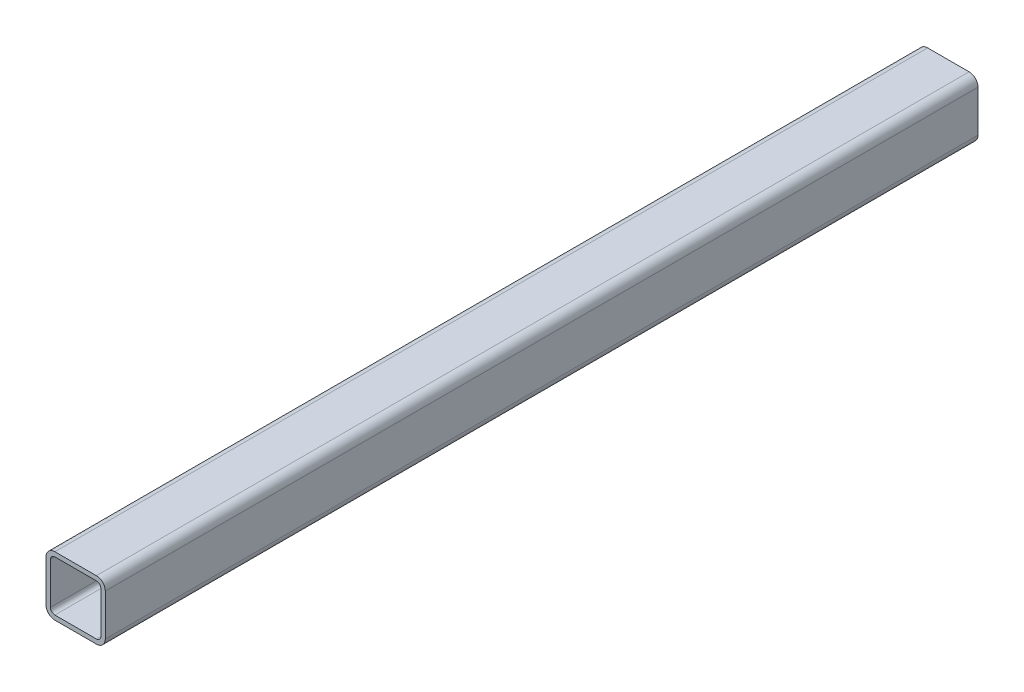
ISO-10303-21;
HEADER;
FILE_DESCRIPTION(('STEP AP214'),'2;1');
FILE_NAME('part.step','',(''),(''),'','','');
FILE_SCHEMA(('AUTOMOTIVE_DESIGN { 1 0 10303 214 1 1 1 1 }'));
ENDSEC;
DATA;
#1=APPLICATION_CONTEXT('core data for automotive mechanical design processes');
#2=APPLICATION_PROTOCOL_DEFINITION('international standard','automotive_design',2000,#1);
#3=PRODUCT_CONTEXT('',#1,'mechanical');
#4=PRODUCT('Part','Part','',(#3));
#5=PRODUCT_RELATED_PRODUCT_CATEGORY('part','',(#4));
#6=PRODUCT_DEFINITION_FORMATION('','',#4);
#7=PRODUCT_DEFINITION_CONTEXT('part definition',#1,'design');
#8=PRODUCT_DEFINITION('design','',#6,#7);
#9=PRODUCT_DEFINITION_SHAPE('','',#8);
#10=(LENGTH_UNIT() NAMED_UNIT(*) SI_UNIT(.MILLI.,.METRE.));
#11=(NAMED_UNIT(*) PLANE_ANGLE_UNIT() SI_UNIT($,.RADIAN.));
#12=(NAMED_UNIT(*) SI_UNIT($,.STERADIAN.) SOLID_ANGLE_UNIT());
#13=UNCERTAINTY_MEASURE_WITH_UNIT(LENGTH_MEASURE(1.E-05),#10,'distance_accuracy_value','');
#14=(GEOMETRIC_REPRESENTATION_CONTEXT(3) GLOBAL_UNCERTAINTY_ASSIGNED_CONTEXT((#13)) GLOBAL_UNIT_ASSIGNED_CONTEXT((#10,
#11,#12)) REPRESENTATION_CONTEXT('',''));
#15=CARTESIAN_POINT('',(0.,0.,0.));
#16=DIRECTION('',(0.,0.,1.));
#17=DIRECTION('',(1.,0.,0.));
#18=AXIS2_PLACEMENT_3D('',#15,#16,#17);
#19=CARTESIAN_POINT('',(14.,14.,294.5));
#20=DIRECTION('',(0.,0.,-1.));
#21=DIRECTION('',(-1.,0.,0.));
#22=AXIS2_PLACEMENT_3D('',#19,#20,#21);
#23=PLANE('',#22);
#24=CARTESIAN_POINT('',(14.,14.,294.5));
#25=DIRECTION('',(0.,0.,1.));
#26=DIRECTION('',(-1.,0.,0.));
#27=AXIS2_PLACEMENT_3D('',#24,#25,#26);
#28=CIRCLE('',#27,6.);
#29=CARTESIAN_POINT('',(20.,14.,294.5));
#30=VERTEX_POINT('',#29);
#31=CARTESIAN_POINT('',(14.,20.,294.5));
#32=VERTEX_POINT('',#31);
#33=EDGE_CURVE('E247',#30,#32,#28,.T.);
#34=ORIENTED_EDGE('',*,*,#33,.T.);
#35=DIRECTION('',(-1.,0.,0.));
#36=VECTOR('',#35,1.);
#37=CARTESIAN_POINT('',(-14.,20.,294.5));
#38=LINE('',#37,#36);
#39=CARTESIAN_POINT('',(-14.,20.,294.5));
#40=VERTEX_POINT('',#39);
#41=EDGE_CURVE('E251',#32,#40,#38,.T.);
#42=ORIENTED_EDGE('',*,*,#41,.T.);
#43=CARTESIAN_POINT('',(-14.,14.,294.5));
#44=DIRECTION('',(0.,0.,1.));
#45=DIRECTION('',(1.,0.,0.));
#46=AXIS2_PLACEMENT_3D('',#43,#44,#45);
#47=CIRCLE('',#46,6.);
#48=CARTESIAN_POINT('',(-20.,14.,294.5));
#49=VERTEX_POINT('',#48);
#50=EDGE_CURVE('E255',#40,#49,#47,.T.);
#51=ORIENTED_EDGE('',*,*,#50,.T.);
#52=DIRECTION('',(0.,-1.,0.));
#53=VECTOR('',#52,1.);
#54=CARTESIAN_POINT('',(-20.,14.,294.5));
#55=LINE('',#54,#53);
#56=CARTESIAN_POINT('',(-20.,-14.,294.5));
#57=VERTEX_POINT('',#56);
#58=EDGE_CURVE('E258',#49,#57,#55,.T.);
#59=ORIENTED_EDGE('',*,*,#58,.T.);
#60=CARTESIAN_POINT('',(-14.,-14.,294.5));
#61=DIRECTION('',(0.,0.,1.));
#62=DIRECTION('',(1.,0.,0.));
#63=AXIS2_PLACEMENT_3D('',#60,#61,#62);
#64=CIRCLE('',#63,6.);
#65=CARTESIAN_POINT('',(-14.,-20.,294.5));
#66=VERTEX_POINT('',#65);
#67=EDGE_CURVE('E261',#57,#66,#64,.T.);
#68=ORIENTED_EDGE('',*,*,#67,.T.);
#69=DIRECTION('',(1.,0.,0.));
#70=VECTOR('',#69,1.);
#71=CARTESIAN_POINT('',(-14.,-20.,294.5));
#72=LINE('',#71,#70);
#73=CARTESIAN_POINT('',(14.,-20.,294.5));
#74=VERTEX_POINT('',#73);
#75=EDGE_CURVE('E264',#66,#74,#72,.T.);
#76=ORIENTED_EDGE('',*,*,#75,.T.);
#77=CARTESIAN_POINT('',(14.,-14.,294.5));
#78=DIRECTION('',(0.,0.,1.));
#79=DIRECTION('',(1.,0.,0.));
#80=AXIS2_PLACEMENT_3D('',#77,#78,#79);
#81=CIRCLE('',#80,6.);
#82=CARTESIAN_POINT('',(20.,-14.,294.5));
#83=VERTEX_POINT('',#82);
#84=EDGE_CURVE('E267',#74,#83,#81,.T.);
#85=ORIENTED_EDGE('',*,*,#84,.T.);
#86=DIRECTION('',(0.,1.,0.));
#87=VECTOR('',#86,1.);
#88=CARTESIAN_POINT('',(20.,14.,294.5));
#89=LINE('',#88,#87);
#90=EDGE_CURVE('E270',#83,#30,#89,.T.);
#91=ORIENTED_EDGE('',*,*,#90,.T.);
#92=EDGE_LOOP('',(#34,#42,#51,#59,#68,#76,#85,#91));
#93=FACE_BOUND('',#92,.T.);
#94=CARTESIAN_POINT('',(-14.,14.,294.5));
#95=DIRECTION('',(0.,0.,1.));
#96=DIRECTION('',(1.,0.,0.));
#97=AXIS2_PLACEMENT_3D('',#94,#95,#96);
#98=CIRCLE('',#97,3.00000000000001);
#99=CARTESIAN_POINT('',(-14.,17.,294.5));
#100=VERTEX_POINT('',#99);
#101=CARTESIAN_POINT('',(-17.,14.,294.5));
#102=VERTEX_POINT('',#101);
#103=EDGE_CURVE('E157',#100,#102,#98,.T.);
#104=ORIENTED_EDGE('',*,*,#103,.F.);
#105=DIRECTION('',(-1.,0.,0.));
#106=VECTOR('',#105,1.);
#107=CARTESIAN_POINT('',(-14.,17.,294.5));
#108=LINE('',#107,#106);
#109=CARTESIAN_POINT('',(14.,17.,294.5));
#110=VERTEX_POINT('',#109);
#111=EDGE_CURVE('E199',#110,#100,#108,.T.);
#112=ORIENTED_EDGE('',*,*,#111,.F.);
#113=CARTESIAN_POINT('',(14.,14.,294.5));
#114=DIRECTION('',(0.,0.,1.));
#115=DIRECTION('',(-1.,0.,0.));
#116=AXIS2_PLACEMENT_3D('',#113,#114,#115);
#117=CIRCLE('',#116,3.);
#118=CARTESIAN_POINT('',(17.,14.,294.5));
#119=VERTEX_POINT('',#118);
#120=EDGE_CURVE('E196',#119,#110,#117,.T.);
#121=ORIENTED_EDGE('',*,*,#120,.F.);
#122=DIRECTION('',(0.,1.,0.));
#123=VECTOR('',#122,1.);
#124=CARTESIAN_POINT('',(17.,14.,294.5));
#125=LINE('',#124,#123);
#126=CARTESIAN_POINT('',(17.,-14.,294.5));
#127=VERTEX_POINT('',#126);
#128=EDGE_CURVE('E193',#127,#119,#125,.T.);
#129=ORIENTED_EDGE('',*,*,#128,.F.);
#130=CARTESIAN_POINT('',(14.,-14.,294.5));
#131=DIRECTION('',(0.,0.,1.));
#132=DIRECTION('',(1.,0.,0.));
#133=AXIS2_PLACEMENT_3D('',#130,#131,#132);
#134=CIRCLE('',#133,3.);
#135=CARTESIAN_POINT('',(14.,-17.,294.5));
#136=VERTEX_POINT('',#135);
#137=EDGE_CURVE('E190',#136,#127,#134,.T.);
#138=ORIENTED_EDGE('',*,*,#137,.F.);
#139=DIRECTION('',(1.,0.,0.));
#140=VECTOR('',#139,1.);
#141=CARTESIAN_POINT('',(-14.,-17.,294.5));
#142=LINE('',#141,#140);
#143=CARTESIAN_POINT('',(-14.,-17.,294.5));
#144=VERTEX_POINT('',#143);
#145=EDGE_CURVE('E185',#144,#136,#142,.T.);
#146=ORIENTED_EDGE('',*,*,#145,.F.);
#147=CARTESIAN_POINT('',(-14.,-14.,294.5));
#148=DIRECTION('',(0.,0.,1.));
#149=DIRECTION('',(1.,0.,0.));
#150=AXIS2_PLACEMENT_3D('',#147,#148,#149);
#151=CIRCLE('',#150,3.);
#152=CARTESIAN_POINT('',(-17.,-14.,294.5));
#153=VERTEX_POINT('',#152);
#154=EDGE_CURVE('E180',#153,#144,#151,.T.);
#155=ORIENTED_EDGE('',*,*,#154,.F.);
#156=DIRECTION('',(0.,-1.,0.));
#157=VECTOR('',#156,1.);
#158=CARTESIAN_POINT('',(-17.,14.,294.5));
#159=LINE('',#158,#157);
#160=EDGE_CURVE('E166',#102,#153,#159,.T.);
#161=ORIENTED_EDGE('',*,*,#160,.F.);
#162=EDGE_LOOP('',(#104,#112,#121,#129,#138,#146,#155,#161));
#163=FACE_BOUND('',#162,.T.);
#164=ADVANCED_FACE('F43',(#93,#163),#23,.F.);
#165=CARTESIAN_POINT('',(14.,14.,-294.5));
#166=DIRECTION('',(0.,0.,-1.));
#167=DIRECTION('',(-1.,0.,0.));
#168=AXIS2_PLACEMENT_3D('',#165,#166,#167);
#169=PLANE('',#168);
#170=CARTESIAN_POINT('',(14.,14.,-294.5));
#171=DIRECTION('',(0.,0.,1.));
#172=DIRECTION('',(-1.,0.,0.));
#173=AXIS2_PLACEMENT_3D('',#170,#171,#172);
#174=CIRCLE('',#173,6.);
#175=CARTESIAN_POINT('',(20.,14.,-294.5));
#176=VERTEX_POINT('',#175);
#177=CARTESIAN_POINT('',(14.,20.,-294.5));
#178=VERTEX_POINT('',#177);
#179=EDGE_CURVE('E175',#176,#178,#174,.T.);
#180=ORIENTED_EDGE('',*,*,#179,.F.);
#181=DIRECTION('',(0.,1.,0.));
#182=VECTOR('',#181,1.);
#183=CARTESIAN_POINT('',(20.,14.,-294.5));
#184=LINE('',#183,#182);
#185=CARTESIAN_POINT('',(20.,-14.,-294.5));
#186=VERTEX_POINT('',#185);
#187=EDGE_CURVE('E252',#186,#176,#184,.T.);
#188=ORIENTED_EDGE('',*,*,#187,.F.);
#189=CARTESIAN_POINT('',(14.,-14.,-294.5));
#190=DIRECTION('',(0.,0.,1.));
#191=DIRECTION('',(1.,0.,0.));
#192=AXIS2_PLACEMENT_3D('',#189,#190,#191);
#193=CIRCLE('',#192,6.);
#194=CARTESIAN_POINT('',(14.,-20.,-294.5));
#195=VERTEX_POINT('',#194);
#196=EDGE_CURVE('E292',#195,#186,#193,.T.);
#197=ORIENTED_EDGE('',*,*,#196,.F.);
#198=DIRECTION('',(1.,0.,0.));
#199=VECTOR('',#198,1.);
#200=CARTESIAN_POINT('',(-14.,-20.,-294.5));
#201=LINE('',#200,#199);
#202=CARTESIAN_POINT('',(-14.,-20.,-294.5));
#203=VERTEX_POINT('',#202);
#204=EDGE_CURVE('E289',#203,#195,#201,.T.);
#205=ORIENTED_EDGE('',*,*,#204,.F.);
#206=CARTESIAN_POINT('',(-14.,-14.,-294.5));
#207=DIRECTION('',(0.,0.,1.));
#208=DIRECTION('',(1.,0.,0.));
#209=AXIS2_PLACEMENT_3D('',#206,#207,#208);
#210=CIRCLE('',#209,6.);
#211=CARTESIAN_POINT('',(-20.,-14.,-294.5));
#212=VERTEX_POINT('',#211);
#213=EDGE_CURVE('E286',#212,#203,#210,.T.);
#214=ORIENTED_EDGE('',*,*,#213,.F.);
#215=DIRECTION('',(0.,-1.,0.));
#216=VECTOR('',#215,1.);
#217=CARTESIAN_POINT('',(-20.,14.,-294.5));
#218=LINE('',#217,#216);
#219=CARTESIAN_POINT('',(-20.,14.,-294.5));
#220=VERTEX_POINT('',#219);
#221=EDGE_CURVE('E283',#220,#212,#218,.T.);
#222=ORIENTED_EDGE('',*,*,#221,.F.);
#223=CARTESIAN_POINT('',(-14.,14.,-294.5));
#224=DIRECTION('',(0.,0.,1.));
#225=DIRECTION('',(1.,0.,0.));
#226=AXIS2_PLACEMENT_3D('',#223,#224,#225);
#227=CIRCLE('',#226,6.);
#228=CARTESIAN_POINT('',(-14.,20.,-294.5));
#229=VERTEX_POINT('',#228);
#230=EDGE_CURVE('E280',#229,#220,#227,.T.);
#231=ORIENTED_EDGE('',*,*,#230,.F.);
#232=DIRECTION('',(-1.,0.,0.));
#233=VECTOR('',#232,1.);
#234=CARTESIAN_POINT('',(-14.,20.,-294.5));
#235=LINE('',#234,#233);
#236=EDGE_CURVE('E277',#178,#229,#235,.T.);
#237=ORIENTED_EDGE('',*,*,#236,.F.);
#238=EDGE_LOOP('',(#180,#188,#197,#205,#214,#222,#231,#237));
#239=FACE_BOUND('',#238,.T.);
#240=DIRECTION('',(-1.,0.,0.));
#241=VECTOR('',#240,1.);
#242=CARTESIAN_POINT('',(-14.,17.,-294.5));
#243=LINE('',#242,#241);
#244=CARTESIAN_POINT('',(14.,17.,-294.5));
#245=VERTEX_POINT('',#244);
#246=CARTESIAN_POINT('',(-14.,17.,-294.5));
#247=VERTEX_POINT('',#246);
#248=EDGE_CURVE('E167',#245,#247,#243,.T.);
#249=ORIENTED_EDGE('',*,*,#248,.T.);
#250=CARTESIAN_POINT('',(-14.,14.,-294.5));
#251=DIRECTION('',(0.,0.,1.));
#252=DIRECTION('',(1.,0.,0.));
#253=AXIS2_PLACEMENT_3D('',#250,#251,#252);
#254=CIRCLE('',#253,3.00000000000001);
#255=CARTESIAN_POINT('',(-17.,14.,-294.5));
#256=VERTEX_POINT('',#255);
#257=EDGE_CURVE('E67',#247,#256,#254,.T.);
#258=ORIENTED_EDGE('',*,*,#257,.T.);
#259=DIRECTION('',(0.,-1.,0.));
#260=VECTOR('',#259,1.);
#261=CARTESIAN_POINT('',(-17.,14.,-294.5));
#262=LINE('',#261,#260);
#263=CARTESIAN_POINT('',(-17.,-14.,-294.5));
#264=VERTEX_POINT('',#263);
#265=EDGE_CURVE('E173',#256,#264,#262,.T.);
#266=ORIENTED_EDGE('',*,*,#265,.T.);
#267=CARTESIAN_POINT('',(-14.,-14.,-294.5));
#268=DIRECTION('',(0.,0.,1.));
#269=DIRECTION('',(1.,0.,0.));
#270=AXIS2_PLACEMENT_3D('',#267,#268,#269);
#271=CIRCLE('',#270,3.);
#272=CARTESIAN_POINT('',(-14.,-17.,-294.5));
#273=VERTEX_POINT('',#272);
#274=EDGE_CURVE('E206',#264,#273,#271,.T.);
#275=ORIENTED_EDGE('',*,*,#274,.T.);
#276=DIRECTION('',(1.,0.,0.));
#277=VECTOR('',#276,1.);
#278=CARTESIAN_POINT('',(-14.,-17.,-294.5));
#279=LINE('',#278,#277);
#280=CARTESIAN_POINT('',(14.,-17.,-294.5));
#281=VERTEX_POINT('',#280);
#282=EDGE_CURVE('E210',#273,#281,#279,.T.);
#283=ORIENTED_EDGE('',*,*,#282,.T.);
#284=CARTESIAN_POINT('',(14.,-14.,-294.5));
#285=DIRECTION('',(0.,0.,1.));
#286=DIRECTION('',(1.,0.,0.));
#287=AXIS2_PLACEMENT_3D('',#284,#285,#286);
#288=CIRCLE('',#287,3.);
#289=CARTESIAN_POINT('',(17.,-14.,-294.5));
#290=VERTEX_POINT('',#289);
#291=EDGE_CURVE('E214',#281,#290,#288,.T.);
#292=ORIENTED_EDGE('',*,*,#291,.T.);
#293=DIRECTION('',(0.,1.,0.));
#294=VECTOR('',#293,1.);
#295=CARTESIAN_POINT('',(17.,14.,-294.5));
#296=LINE('',#295,#294);
#297=CARTESIAN_POINT('',(17.,14.,-294.5));
#298=VERTEX_POINT('',#297);
#299=EDGE_CURVE('E218',#290,#298,#296,.T.);
#300=ORIENTED_EDGE('',*,*,#299,.T.);
#301=CARTESIAN_POINT('',(14.,14.,-294.5));
#302=DIRECTION('',(0.,0.,1.));
#303=DIRECTION('',(-1.,0.,0.));
#304=AXIS2_PLACEMENT_3D('',#301,#302,#303);
#305=CIRCLE('',#304,3.);
#306=EDGE_CURVE('E222',#298,#245,#305,.T.);
#307=ORIENTED_EDGE('',*,*,#306,.T.);
#308=EDGE_LOOP('',(#249,#258,#266,#275,#283,#292,#300,#307));
#309=FACE_BOUND('',#308,.T.);
#310=ADVANCED_FACE('F332',(#239,#309),#169,.T.);
#311=CARTESIAN_POINT('',(14.,14.,294.5));
#312=DIRECTION('',(0.,0.,-1.));
#313=DIRECTION('',(-1.,0.,0.));
#314=AXIS2_PLACEMENT_3D('',#311,#312,#313);
#315=CYLINDRICAL_SURFACE('',#314,6.);
#316=ORIENTED_EDGE('',*,*,#179,.T.);
#317=DIRECTION('',(0.,0.,-1.));
#318=VECTOR('',#317,1.);
#319=CARTESIAN_POINT('',(14.,20.,294.5));
#320=LINE('',#319,#318);
#321=EDGE_CURVE('E11',#32,#178,#320,.T.);
#322=ORIENTED_EDGE('',*,*,#321,.F.);
#323=ORIENTED_EDGE('',*,*,#33,.F.);
#324=DIRECTION('',(0.,0.,-1.));
#325=VECTOR('',#324,1.);
#326=CARTESIAN_POINT('',(20.,14.,294.5));
#327=LINE('',#326,#325);
#328=EDGE_CURVE('E273',#30,#176,#327,.T.);
#329=ORIENTED_EDGE('',*,*,#328,.T.);
#330=EDGE_LOOP('',(#316,#322,#323,#329));
#331=FACE_BOUND('',#330,.T.);
#332=ADVANCED_FACE('F45',(#331),#315,.T.);
#333=CARTESIAN_POINT('',(-14.,20.,294.5));
#334=DIRECTION('',(0.,-1.,0.));
#335=DIRECTION('',(0.,0.,-1.));
#336=AXIS2_PLACEMENT_3D('',#333,#334,#335);
#337=PLANE('',#336);
#338=ORIENTED_EDGE('',*,*,#236,.T.);
#339=DIRECTION('',(0.,0.,-1.));
#340=VECTOR('',#339,1.);
#341=CARTESIAN_POINT('',(-14.,20.,294.5));
#342=LINE('',#341,#340);
#343=EDGE_CURVE('E52',#40,#229,#342,.T.);
#344=ORIENTED_EDGE('',*,*,#343,.F.);
#345=ORIENTED_EDGE('',*,*,#41,.F.);
#346=ORIENTED_EDGE('',*,*,#321,.T.);
#347=EDGE_LOOP('',(#338,#344,#345,#346));
#348=FACE_BOUND('',#347,.T.);
#349=ADVANCED_FACE('F349',(#348),#337,.F.);
#350=CARTESIAN_POINT('',(-14.,14.,294.5));
#351=DIRECTION('',(0.,0.,-1.));
#352=DIRECTION('',(-1.,0.,0.));
#353=AXIS2_PLACEMENT_3D('',#350,#351,#352);
#354=CYLINDRICAL_SURFACE('',#353,6.);
#355=ORIENTED_EDGE('',*,*,#230,.T.);
#356=DIRECTION('',(0.,0.,-1.));
#357=VECTOR('',#356,1.);
#358=CARTESIAN_POINT('',(-20.,14.,294.5));
#359=LINE('',#358,#357);
#360=EDGE_CURVE('E316',#49,#220,#359,.T.);
#361=ORIENTED_EDGE('',*,*,#360,.F.);
#362=ORIENTED_EDGE('',*,*,#50,.F.);
#363=ORIENTED_EDGE('',*,*,#343,.T.);
#364=EDGE_LOOP('',(#355,#361,#362,#363));
#365=FACE_BOUND('',#364,.T.);
#366=ADVANCED_FACE('F326',(#365),#354,.T.);
#367=CARTESIAN_POINT('',(-20.,14.,294.5));
#368=DIRECTION('',(1.,0.,0.));
#369=DIRECTION('',(0.,1.,0.));
#370=AXIS2_PLACEMENT_3D('',#367,#368,#369);
#371=PLANE('',#370);
#372=ORIENTED_EDGE('',*,*,#221,.T.);
#373=DIRECTION('',(0.,0.,-1.));
#374=VECTOR('',#373,1.);
#375=CARTESIAN_POINT('',(-20.,-14.,294.5));
#376=LINE('',#375,#374);
#377=EDGE_CURVE('E312',#57,#212,#376,.T.);
#378=ORIENTED_EDGE('',*,*,#377,.F.);
#379=ORIENTED_EDGE('',*,*,#58,.F.);
#380=ORIENTED_EDGE('',*,*,#360,.T.);
#381=EDGE_LOOP('',(#372,#378,#379,#380));
#382=FACE_BOUND('',#381,.T.);
#383=ADVANCED_FACE('F338',(#382),#371,.F.);
#384=CARTESIAN_POINT('',(-14.,-14.,294.5));
#385=DIRECTION('',(0.,0.,-1.));
#386=DIRECTION('',(-1.,0.,0.));
#387=AXIS2_PLACEMENT_3D('',#384,#385,#386);
#388=CYLINDRICAL_SURFACE('',#387,6.);
#389=ORIENTED_EDGE('',*,*,#213,.T.);
#390=DIRECTION('',(0.,0.,-1.));
#391=VECTOR('',#390,1.);
#392=CARTESIAN_POINT('',(-14.,-20.,294.5));
#393=LINE('',#392,#391);
#394=EDGE_CURVE('E308',#66,#203,#393,.T.);
#395=ORIENTED_EDGE('',*,*,#394,.F.);
#396=ORIENTED_EDGE('',*,*,#67,.F.);
#397=ORIENTED_EDGE('',*,*,#377,.T.);
#398=EDGE_LOOP('',(#389,#395,#396,#397));
#399=FACE_BOUND('',#398,.T.);
#400=ADVANCED_FACE('F342',(#399),#388,.T.);
#401=CARTESIAN_POINT('',(-14.,-20.,294.5));
#402=DIRECTION('',(0.,1.,0.));
#403=DIRECTION('',(0.,0.,1.));
#404=AXIS2_PLACEMENT_3D('',#401,#402,#403);
#405=PLANE('',#404);
#406=ORIENTED_EDGE('',*,*,#204,.T.);
#407=DIRECTION('',(0.,0.,-1.));
#408=VECTOR('',#407,1.);
#409=CARTESIAN_POINT('',(14.,-20.,294.5));
#410=LINE('',#409,#408);
#411=EDGE_CURVE('E304',#74,#195,#410,.T.);
#412=ORIENTED_EDGE('',*,*,#411,.F.);
#413=ORIENTED_EDGE('',*,*,#75,.F.);
#414=ORIENTED_EDGE('',*,*,#394,.T.);
#415=EDGE_LOOP('',(#406,#412,#413,#414));
#416=FACE_BOUND('',#415,.T.);
#417=ADVANCED_FACE('F362',(#416),#405,.F.);
#418=CARTESIAN_POINT('',(14.,-14.,294.5));
#419=DIRECTION('',(0.,0.,-1.));
#420=DIRECTION('',(-1.,0.,0.));
#421=AXIS2_PLACEMENT_3D('',#418,#419,#420);
#422=CYLINDRICAL_SURFACE('',#421,6.);
#423=ORIENTED_EDGE('',*,*,#196,.T.);
#424=DIRECTION('',(0.,0.,-1.));
#425=VECTOR('',#424,1.);
#426=CARTESIAN_POINT('',(20.,-14.,294.5));
#427=LINE('',#426,#425);
#428=EDGE_CURVE('E300',#83,#186,#427,.T.);
#429=ORIENTED_EDGE('',*,*,#428,.F.);
#430=ORIENTED_EDGE('',*,*,#84,.F.);
#431=ORIENTED_EDGE('',*,*,#411,.T.);
#432=EDGE_LOOP('',(#423,#429,#430,#431));
#433=FACE_BOUND('',#432,.T.);
#434=ADVANCED_FACE('F360',(#433),#422,.T.);
#435=CARTESIAN_POINT('',(20.,14.,294.5));
#436=DIRECTION('',(-1.,0.,0.));
#437=DIRECTION('',(0.,0.,1.));
#438=AXIS2_PLACEMENT_3D('',#435,#436,#437);
#439=PLANE('',#438);
#440=ORIENTED_EDGE('',*,*,#187,.T.);
#441=ORIENTED_EDGE('',*,*,#328,.F.);
#442=ORIENTED_EDGE('',*,*,#90,.F.);
#443=ORIENTED_EDGE('',*,*,#428,.T.);
#444=EDGE_LOOP('',(#440,#441,#442,#443));
#445=FACE_BOUND('',#444,.T.);
#446=ADVANCED_FACE('F355',(#445),#439,.F.);
#447=CARTESIAN_POINT('',(-14.,14.,294.5));
#448=DIRECTION('',(0.,0.,-1.));
#449=DIRECTION('',(-1.,0.,0.));
#450=AXIS2_PLACEMENT_3D('',#447,#448,#449);
#451=CYLINDRICAL_SURFACE('',#450,3.00000000000001);
#452=ORIENTED_EDGE('',*,*,#257,.F.);
#453=DIRECTION('',(0.,0.,-1.));
#454=VECTOR('',#453,1.);
#455=CARTESIAN_POINT('',(-14.,17.,294.5));
#456=LINE('',#455,#454);
#457=EDGE_CURVE('E161',#100,#247,#456,.T.);
#458=ORIENTED_EDGE('',*,*,#457,.F.);
#459=ORIENTED_EDGE('',*,*,#103,.T.);
#460=DIRECTION('',(0.,0.,-1.));
#461=VECTOR('',#460,1.);
#462=CARTESIAN_POINT('',(-17.,14.,294.5));
#463=LINE('',#462,#461);
#464=EDGE_CURVE('E160',#102,#256,#463,.T.);
#465=ORIENTED_EDGE('',*,*,#464,.T.);
#466=EDGE_LOOP('',(#452,#458,#459,#465));
#467=FACE_BOUND('',#466,.T.);
#468=ADVANCED_FACE('F159',(#467),#451,.F.);
#469=CARTESIAN_POINT('',(-17.,14.,294.5));
#470=DIRECTION('',(1.,0.,0.));
#471=DIRECTION('',(0.,1.,0.));
#472=AXIS2_PLACEMENT_3D('',#469,#470,#471);
#473=PLANE('',#472);
#474=ORIENTED_EDGE('',*,*,#265,.F.);
#475=ORIENTED_EDGE('',*,*,#464,.F.);
#476=ORIENTED_EDGE('',*,*,#160,.T.);
#477=DIRECTION('',(0.,0.,-1.));
#478=VECTOR('',#477,1.);
#479=CARTESIAN_POINT('',(-17.,-14.,294.5));
#480=LINE('',#479,#478);
#481=EDGE_CURVE('E176',#153,#264,#480,.T.);
#482=ORIENTED_EDGE('',*,*,#481,.T.);
#483=EDGE_LOOP('',(#474,#475,#476,#482));
#484=FACE_BOUND('',#483,.T.);
#485=ADVANCED_FACE('F170',(#484),#473,.T.);
#486=CARTESIAN_POINT('',(-14.,-14.,294.5));
#487=DIRECTION('',(0.,0.,-1.));
#488=DIRECTION('',(-1.,0.,0.));
#489=AXIS2_PLACEMENT_3D('',#486,#487,#488);
#490=CYLINDRICAL_SURFACE('',#489,3.);
#491=ORIENTED_EDGE('',*,*,#274,.F.);
#492=ORIENTED_EDGE('',*,*,#481,.F.);
#493=ORIENTED_EDGE('',*,*,#154,.T.);
#494=DIRECTION('',(0.,0.,-1.));
#495=VECTOR('',#494,1.);
#496=CARTESIAN_POINT('',(-14.,-17.,294.5));
#497=LINE('',#496,#495);
#498=EDGE_CURVE('E242',#144,#273,#497,.T.);
#499=ORIENTED_EDGE('',*,*,#498,.T.);
#500=EDGE_LOOP('',(#491,#492,#493,#499));
#501=FACE_BOUND('',#500,.T.);
#502=ADVANCED_FACE('F387',(#501),#490,.F.);
#503=CARTESIAN_POINT('',(-14.,-17.,294.5));
#504=DIRECTION('',(0.,1.,0.));
#505=DIRECTION('',(0.,0.,1.));
#506=AXIS2_PLACEMENT_3D('',#503,#504,#505);
#507=PLANE('',#506);
#508=ORIENTED_EDGE('',*,*,#282,.F.);
#509=ORIENTED_EDGE('',*,*,#498,.F.);
#510=ORIENTED_EDGE('',*,*,#145,.T.);
#511=DIRECTION('',(0.,0.,-1.));
#512=VECTOR('',#511,1.);
#513=CARTESIAN_POINT('',(14.,-17.,294.5));
#514=LINE('',#513,#512);
#515=EDGE_CURVE('E239',#136,#281,#514,.T.);
#516=ORIENTED_EDGE('',*,*,#515,.T.);
#517=EDGE_LOOP('',(#508,#509,#510,#516));
#518=FACE_BOUND('',#517,.T.);
#519=ADVANCED_FACE('F391',(#518),#507,.T.);
#520=CARTESIAN_POINT('',(14.,-14.,294.5));
#521=DIRECTION('',(0.,0.,-1.));
#522=DIRECTION('',(-1.,0.,0.));
#523=AXIS2_PLACEMENT_3D('',#520,#521,#522);
#524=CYLINDRICAL_SURFACE('',#523,3.);
#525=ORIENTED_EDGE('',*,*,#291,.F.);
#526=ORIENTED_EDGE('',*,*,#515,.F.);
#527=ORIENTED_EDGE('',*,*,#137,.T.);
#528=DIRECTION('',(0.,0.,-1.));
#529=VECTOR('',#528,1.);
#530=CARTESIAN_POINT('',(17.,-14.,294.5));
#531=LINE('',#530,#529);
#532=EDGE_CURVE('E236',#127,#290,#531,.T.);
#533=ORIENTED_EDGE('',*,*,#532,.T.);
#534=EDGE_LOOP('',(#525,#526,#527,#533));
#535=FACE_BOUND('',#534,.T.);
#536=ADVANCED_FACE('F397',(#535),#524,.F.);
#537=CARTESIAN_POINT('',(17.,14.,294.5));
#538=DIRECTION('',(-1.,0.,0.));
#539=DIRECTION('',(0.,0.,1.));
#540=AXIS2_PLACEMENT_3D('',#537,#538,#539);
#541=PLANE('',#540);
#542=ORIENTED_EDGE('',*,*,#299,.F.);
#543=ORIENTED_EDGE('',*,*,#532,.F.);
#544=ORIENTED_EDGE('',*,*,#128,.T.);
#545=DIRECTION('',(0.,0.,-1.));
#546=VECTOR('',#545,1.);
#547=CARTESIAN_POINT('',(17.,14.,294.5));
#548=LINE('',#547,#546);
#549=EDGE_CURVE('E233',#119,#298,#548,.T.);
#550=ORIENTED_EDGE('',*,*,#549,.T.);
#551=EDGE_LOOP('',(#542,#543,#544,#550));
#552=FACE_BOUND('',#551,.T.);
#553=ADVANCED_FACE('F401',(#552),#541,.T.);
#554=CARTESIAN_POINT('',(14.,14.,294.5));
#555=DIRECTION('',(0.,0.,-1.));
#556=DIRECTION('',(-1.,0.,0.));
#557=AXIS2_PLACEMENT_3D('',#554,#555,#556);
#558=CYLINDRICAL_SURFACE('',#557,3.);
#559=ORIENTED_EDGE('',*,*,#306,.F.);
#560=ORIENTED_EDGE('',*,*,#549,.F.);
#561=ORIENTED_EDGE('',*,*,#120,.T.);
#562=DIRECTION('',(0.,0.,-1.));
#563=VECTOR('',#562,1.);
#564=CARTESIAN_POINT('',(14.,17.,294.5));
#565=LINE('',#564,#563);
#566=EDGE_CURVE('E59',#110,#245,#565,.T.);
#567=ORIENTED_EDGE('',*,*,#566,.T.);
#568=EDGE_LOOP('',(#559,#560,#561,#567));
#569=FACE_BOUND('',#568,.T.);
#570=ADVANCED_FACE('F405',(#569),#558,.F.);
#571=CARTESIAN_POINT('',(-14.,17.,294.5));
#572=DIRECTION('',(0.,-1.,0.));
#573=DIRECTION('',(0.,0.,-1.));
#574=AXIS2_PLACEMENT_3D('',#571,#572,#573);
#575=PLANE('',#574);
#576=ORIENTED_EDGE('',*,*,#248,.F.);
#577=ORIENTED_EDGE('',*,*,#566,.F.);
#578=ORIENTED_EDGE('',*,*,#111,.T.);
#579=ORIENTED_EDGE('',*,*,#457,.T.);
#580=EDGE_LOOP('',(#576,#577,#578,#579));
#581=FACE_BOUND('',#580,.T.);
#582=ADVANCED_FACE('F409',(#581),#575,.T.);
#583=CLOSED_SHELL('',(#164,#310,#332,#349,#366,#383,#400,#417,#434,#446,#468,#485,#502,#519,
#536,#553,#570,#582));
#584=MANIFOLD_SOLID_BREP('B2',#583);
#585=ADVANCED_BREP_SHAPE_REPRESENTATION('',(#18,#584),#14);
#586=SHAPE_DEFINITION_REPRESENTATION(#9,#585);
ENDSEC;
END-ISO-10303-21;
